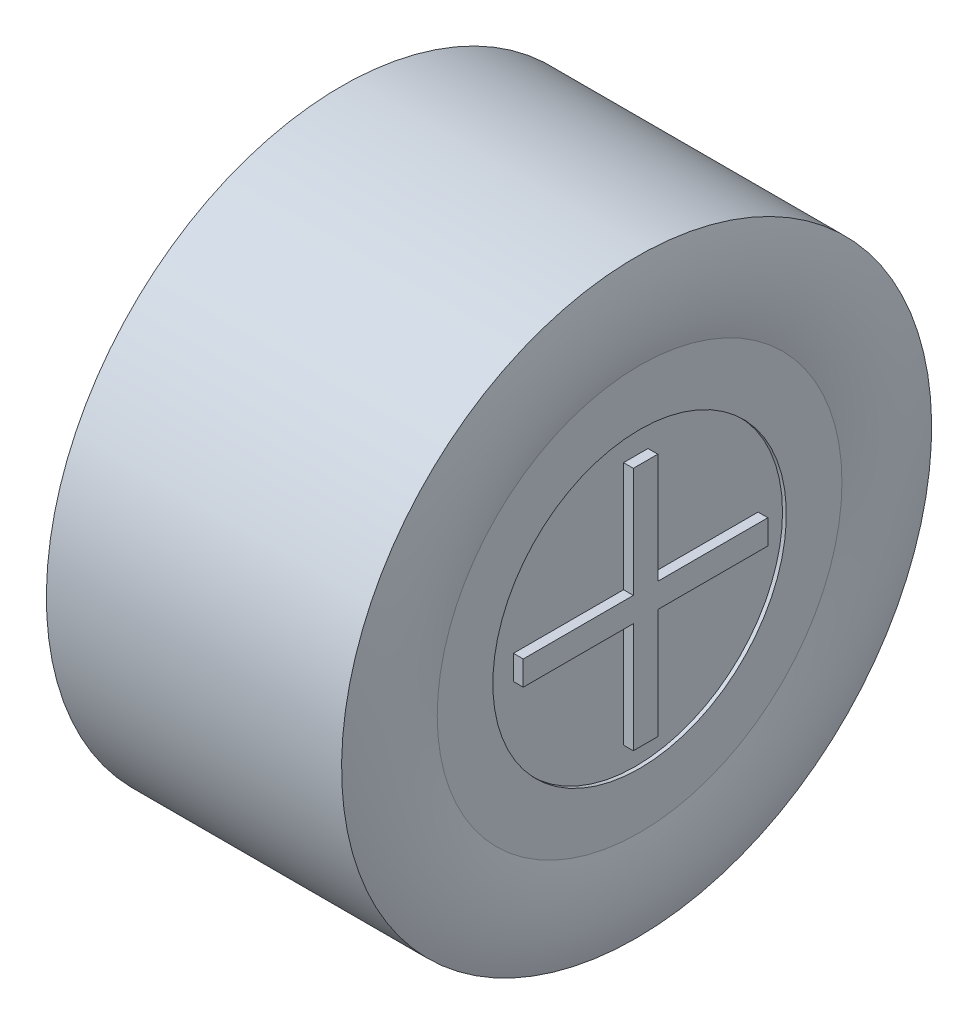
ISO-10303-21;
HEADER;
FILE_DESCRIPTION(('STEP AP214'),'2;1');
FILE_NAME('part.step','',(''),(''),'','','');
FILE_SCHEMA(('AUTOMOTIVE_DESIGN { 1 0 10303 214 1 1 1 1 }'));
ENDSEC;
DATA;
#1=APPLICATION_CONTEXT('core data for automotive mechanical design processes');
#2=APPLICATION_PROTOCOL_DEFINITION('international standard','automotive_design',2000,#1);
#3=PRODUCT_CONTEXT('',#1,'mechanical');
#4=PRODUCT('Part','Part','',(#3));
#5=PRODUCT_RELATED_PRODUCT_CATEGORY('part','',(#4));
#6=PRODUCT_DEFINITION_FORMATION('','',#4);
#7=PRODUCT_DEFINITION_CONTEXT('part definition',#1,'design');
#8=PRODUCT_DEFINITION('design','',#6,#7);
#9=PRODUCT_DEFINITION_SHAPE('','',#8);
#10=(LENGTH_UNIT() NAMED_UNIT(*) SI_UNIT(.MILLI.,.METRE.));
#11=(NAMED_UNIT(*) PLANE_ANGLE_UNIT() SI_UNIT($,.RADIAN.));
#12=(NAMED_UNIT(*) SI_UNIT($,.STERADIAN.) SOLID_ANGLE_UNIT());
#13=UNCERTAINTY_MEASURE_WITH_UNIT(LENGTH_MEASURE(1.E-05),#10,'distance_accuracy_value','');
#14=(GEOMETRIC_REPRESENTATION_CONTEXT(3) GLOBAL_UNCERTAINTY_ASSIGNED_CONTEXT((#13)) GLOBAL_UNIT_ASSIGNED_CONTEXT((#10,
#11,#12)) REPRESENTATION_CONTEXT('',''));
#15=CARTESIAN_POINT('',(0.,0.,0.));
#16=DIRECTION('',(0.,0.,1.));
#17=DIRECTION('',(1.,0.,0.));
#18=AXIS2_PLACEMENT_3D('',#15,#16,#17);
#19=CARTESIAN_POINT('',(30.,0.,0.));
#20=DIRECTION('',(1.,0.,0.));
#21=DIRECTION('',(0.,0.,-1.));
#22=AXIS2_PLACEMENT_3D('',#19,#20,#21);
#23=PLANE('',#22);
#24=CARTESIAN_POINT('',(30.,0.,0.));
#25=DIRECTION('',(1.,0.,0.));
#26=DIRECTION('',(0.,0.,-1.));
#27=AXIS2_PLACEMENT_3D('',#24,#25,#26);
#28=CIRCLE('',#27,30.);
#29=CARTESIAN_POINT('',(30.,0.,-30.));
#30=VERTEX_POINT('',#29);
#31=EDGE_CURVE('E165',#30,#30,#28,.T.);
#32=ORIENTED_EDGE('',*,*,#31,.T.);
#33=EDGE_LOOP('',(#32));
#34=FACE_BOUND('',#33,.T.);
#35=DIRECTION('',(0.,-1.,0.));
#36=VECTOR('',#35,1.);
#37=CARTESIAN_POINT('',(30.,0.,2.5));
#38=LINE('',#37,#36);
#39=CARTESIAN_POINT('',(30.,25.,2.5));
#40=VERTEX_POINT('',#39);
#41=CARTESIAN_POINT('',(30.,2.5,2.5));
#42=VERTEX_POINT('',#41);
#43=EDGE_CURVE('E60',#40,#42,#38,.T.);
#44=ORIENTED_EDGE('',*,*,#43,.F.);
#45=DIRECTION('',(0.,0.,1.));
#46=VECTOR('',#45,1.);
#47=CARTESIAN_POINT('',(30.,25.,0.));
#48=LINE('',#47,#46);
#49=CARTESIAN_POINT('',(30.,25.,-2.5));
#50=VERTEX_POINT('',#49);
#51=EDGE_CURVE('E158',#50,#40,#48,.T.);
#52=ORIENTED_EDGE('',*,*,#51,.F.);
#53=DIRECTION('',(0.,-1.,0.));
#54=VECTOR('',#53,1.);
#55=CARTESIAN_POINT('',(30.,0.,-2.5));
#56=LINE('',#55,#54);
#57=CARTESIAN_POINT('',(30.,2.5,-2.5));
#58=VERTEX_POINT('',#57);
#59=EDGE_CURVE('E155',#50,#58,#56,.T.);
#60=ORIENTED_EDGE('',*,*,#59,.T.);
#61=DIRECTION('',(0.,0.,-1.));
#62=VECTOR('',#61,1.);
#63=CARTESIAN_POINT('',(30.,2.5,0.));
#64=LINE('',#63,#62);
#65=CARTESIAN_POINT('',(30.,2.5,-25.));
#66=VERTEX_POINT('',#65);
#67=EDGE_CURVE('E562',#58,#66,#64,.T.);
#68=ORIENTED_EDGE('',*,*,#67,.T.);
#69=DIRECTION('',(0.,-1.,0.));
#70=VECTOR('',#69,1.);
#71=CARTESIAN_POINT('',(30.,0.,-25.));
#72=LINE('',#71,#70);
#73=CARTESIAN_POINT('',(30.,-2.5,-25.));
#74=VERTEX_POINT('',#73);
#75=EDGE_CURVE('E565',#66,#74,#72,.T.);
#76=ORIENTED_EDGE('',*,*,#75,.T.);
#77=DIRECTION('',(0.,0.,-1.));
#78=VECTOR('',#77,1.);
#79=CARTESIAN_POINT('',(30.,-2.5,0.));
#80=LINE('',#79,#78);
#81=CARTESIAN_POINT('',(30.,-2.5,-2.5));
#82=VERTEX_POINT('',#81);
#83=EDGE_CURVE('E629',#82,#74,#80,.T.);
#84=ORIENTED_EDGE('',*,*,#83,.F.);
#85=DIRECTION('',(0.,-1.,0.));
#86=VECTOR('',#85,1.);
#87=CARTESIAN_POINT('',(30.,0.,-2.5));
#88=LINE('',#87,#86);
#89=CARTESIAN_POINT('',(30.,-25.,-2.5));
#90=VERTEX_POINT('',#89);
#91=EDGE_CURVE('E626',#82,#90,#88,.T.);
#92=ORIENTED_EDGE('',*,*,#91,.T.);
#93=DIRECTION('',(0.,0.,1.));
#94=VECTOR('',#93,1.);
#95=CARTESIAN_POINT('',(30.,-25.,0.));
#96=LINE('',#95,#94);
#97=CARTESIAN_POINT('',(30.,-25.,2.5));
#98=VERTEX_POINT('',#97);
#99=EDGE_CURVE('E623',#90,#98,#96,.T.);
#100=ORIENTED_EDGE('',*,*,#99,.T.);
#101=DIRECTION('',(0.,-1.,0.));
#102=VECTOR('',#101,1.);
#103=CARTESIAN_POINT('',(30.,0.,2.5));
#104=LINE('',#103,#102);
#105=CARTESIAN_POINT('',(30.,-2.5,2.5));
#106=VERTEX_POINT('',#105);
#107=EDGE_CURVE('E619',#106,#98,#104,.T.);
#108=ORIENTED_EDGE('',*,*,#107,.F.);
#109=DIRECTION('',(0.,0.,-1.));
#110=VECTOR('',#109,1.);
#111=CARTESIAN_POINT('',(30.,-2.5,0.));
#112=LINE('',#111,#110);
#113=CARTESIAN_POINT('',(30.,-2.5,25.));
#114=VERTEX_POINT('',#113);
#115=EDGE_CURVE('E611',#114,#106,#112,.T.);
#116=ORIENTED_EDGE('',*,*,#115,.F.);
#117=DIRECTION('',(0.,-1.,0.));
#118=VECTOR('',#117,1.);
#119=CARTESIAN_POINT('',(30.,0.,25.));
#120=LINE('',#119,#118);
#121=CARTESIAN_POINT('',(30.,2.5,25.));
#122=VERTEX_POINT('',#121);
#123=EDGE_CURVE('E605',#122,#114,#120,.T.);
#124=ORIENTED_EDGE('',*,*,#123,.F.);
#125=DIRECTION('',(0.,0.,-1.));
#126=VECTOR('',#125,1.);
#127=CARTESIAN_POINT('',(30.,2.5,0.));
#128=LINE('',#127,#126);
#129=EDGE_CURVE('E65',#122,#42,#128,.T.);
#130=ORIENTED_EDGE('',*,*,#129,.T.);
#131=EDGE_LOOP('',(#44,#52,#60,#68,#76,#84,#92,#100,#108,#116,#124,#130));
#132=FACE_BOUND('',#131,.T.);
#133=ADVANCED_FACE('F42',(#34,#132),#23,.T.);
#134=CARTESIAN_POINT('',(-80.6535607493196,0.,0.));
#135=DIRECTION('',(-1.,0.,0.));
#136=DIRECTION('',(0.,-1.,0.));
#137=AXIS2_PLACEMENT_3D('',#134,#135,#136);
#138=CYLINDRICAL_SURFACE('',#137,30.);
#139=CARTESIAN_POINT('',(-30.7818119286805,0.,0.));
#140=DIRECTION('',(-1.,0.,0.));
#141=DIRECTION('',(0.,-1.,0.));
#142=AXIS2_PLACEMENT_3D('',#139,#140,#141);
#143=CIRCLE('',#142,30.);
#144=CARTESIAN_POINT('',(-30.7818119286805,-30.,0.));
#145=VERTEX_POINT('',#144);
#146=EDGE_CURVE('E274',#145,#145,#143,.T.);
#147=ORIENTED_EDGE('',*,*,#146,.T.);
#148=EDGE_LOOP('',(#147));
#149=FACE_BOUND('',#148,.T.);
#150=CARTESIAN_POINT('',(-30.,0.,0.));
#151=DIRECTION('',(1.,0.,0.));
#152=DIRECTION('',(0.,0.,-1.));
#153=AXIS2_PLACEMENT_3D('',#150,#151,#152);
#154=CIRCLE('',#153,30.);
#155=CARTESIAN_POINT('',(-30.,0.,-30.));
#156=VERTEX_POINT('',#155);
#157=EDGE_CURVE('E53',#156,#156,#154,.F.);
#158=ORIENTED_EDGE('',*,*,#157,.F.);
#159=EDGE_LOOP('',(#158));
#160=FACE_BOUND('',#159,.T.);
#161=ADVANCED_FACE('F286',(#149,#160),#138,.F.);
#162=CARTESIAN_POINT('',(-30.7818119286805,30.,0.));
#163=DIRECTION('',(1.,0.,0.));
#164=DIRECTION('',(0.,1.,0.));
#165=AXIS2_PLACEMENT_3D('',#162,#163,#164);
#166=PLANE('',#165);
#167=ORIENTED_EDGE('',*,*,#146,.F.);
#168=EDGE_LOOP('',(#167));
#169=FACE_BOUND('',#168,.T.);
#170=CARTESIAN_POINT('',(-30.7818119286805,0.,0.));
#171=DIRECTION('',(-1.,0.,0.));
#172=DIRECTION('',(0.,-1.,0.));
#173=AXIS2_PLACEMENT_3D('',#170,#171,#172);
#174=CIRCLE('',#173,41.3646241331419);
#175=CARTESIAN_POINT('',(-30.7818119286805,-41.3646241331418,0.));
#176=VERTEX_POINT('',#175);
#177=EDGE_CURVE('E270',#176,#176,#174,.T.);
#178=ORIENTED_EDGE('',*,*,#177,.T.);
#179=EDGE_LOOP('',(#178));
#180=FACE_BOUND('',#179,.T.);
#181=ADVANCED_FACE('F229',(#169,#180),#166,.F.);
#182=CARTESIAN_POINT('',(-30.1715902193962,60.3044283000212,0.));
#183=CARTESIAN_POINT('',(-33.1631614911437,50.9503913846076,0.));
#184=CARTESIAN_POINT('',(-30.7818119286805,41.3646241331419,0.));
#185=B_SPLINE_CURVE_WITH_KNOTS('',2,(#182,#183,#184),.UNSPECIFIED.,.F.,.F.,(3,3),(0.,1.),.UNSPECIFIED.);
#186=CARTESIAN_POINT('',(-80.6535607493196,0.,0.));
#187=DIRECTION('',(-1.,0.,0.));
#188=AXIS1_PLACEMENT('',#186,#187);
#189=SURFACE_OF_REVOLUTION('',#185,#188);
#190=ORIENTED_EDGE('',*,*,#177,.F.);
#191=EDGE_LOOP('',(#190));
#192=FACE_BOUND('',#191,.T.);
#193=CARTESIAN_POINT('',(-30.1715902193962,0.,0.));
#194=DIRECTION('',(-1.,0.,0.));
#195=DIRECTION('',(0.,-1.,0.));
#196=AXIS2_PLACEMENT_3D('',#193,#194,#195);
#197=CIRCLE('',#196,60.3044283000212);
#198=CARTESIAN_POINT('',(-30.1715902193962,-60.3044283000212,0.));
#199=VERTEX_POINT('',#198);
#200=EDGE_CURVE('E266',#199,#199,#197,.T.);
#201=ORIENTED_EDGE('',*,*,#200,.T.);
#202=EDGE_LOOP('',(#201));
#203=FACE_BOUND('',#202,.T.);
#204=ADVANCED_FACE('F225',(#192,#203),#189,.T.);
#205=CARTESIAN_POINT('',(-80.6535607493196,0.,0.));
#206=DIRECTION('',(-1.,0.,0.));
#207=DIRECTION('',(0.,-1.,0.));
#208=AXIS2_PLACEMENT_3D('',#205,#206,#207);
#209=CYLINDRICAL_SURFACE('',#208,60.3044283000212);
#210=ORIENTED_EDGE('',*,*,#200,.F.);
#211=EDGE_LOOP('',(#210));
#212=FACE_BOUND('',#211,.T.);
#213=CARTESIAN_POINT('',(30.1715902193963,0.,0.));
#214=DIRECTION('',(-1.,0.,0.));
#215=DIRECTION('',(0.,-1.,0.));
#216=AXIS2_PLACEMENT_3D('',#213,#214,#215);
#217=CIRCLE('',#216,60.3044283000212);
#218=CARTESIAN_POINT('',(30.1715902193963,-60.3044283000212,0.));
#219=VERTEX_POINT('',#218);
#220=EDGE_CURVE('E262',#219,#219,#217,.T.);
#221=ORIENTED_EDGE('',*,*,#220,.T.);
#222=EDGE_LOOP('',(#221));
#223=FACE_BOUND('',#222,.T.);
#224=ADVANCED_FACE('F221',(#212,#223),#209,.T.);
#225=CARTESIAN_POINT('',(30.7818119286805,41.3646241331419,0.));
#226=CARTESIAN_POINT('',(33.1631614911437,50.9503913846076,0.));
#227=CARTESIAN_POINT('',(30.1715902193962,60.3044283000212,0.));
#228=B_SPLINE_CURVE_WITH_KNOTS('',2,(#225,#226,#227),.UNSPECIFIED.,.F.,.F.,(3,3),(0.,1.),.UNSPECIFIED.);
#229=CARTESIAN_POINT('',(-80.6535607493196,0.,0.));
#230=DIRECTION('',(-1.,0.,0.));
#231=AXIS1_PLACEMENT('',#229,#230);
#232=SURFACE_OF_REVOLUTION('',#228,#231);
#233=ORIENTED_EDGE('',*,*,#220,.F.);
#234=EDGE_LOOP('',(#233));
#235=FACE_BOUND('',#234,.T.);
#236=CARTESIAN_POINT('',(30.7818119286806,0.,0.));
#237=DIRECTION('',(-1.,0.,0.));
#238=DIRECTION('',(0.,-1.,0.));
#239=AXIS2_PLACEMENT_3D('',#236,#237,#238);
#240=CIRCLE('',#239,41.3646241331418);
#241=CARTESIAN_POINT('',(30.7818119286806,-41.3646241331418,0.));
#242=VERTEX_POINT('',#241);
#243=EDGE_CURVE('E258',#242,#242,#240,.T.);
#244=ORIENTED_EDGE('',*,*,#243,.T.);
#245=EDGE_LOOP('',(#244));
#246=FACE_BOUND('',#245,.T.);
#247=ADVANCED_FACE('F217',(#235,#246),#232,.T.);
#248=CARTESIAN_POINT('',(30.7818119286805,30.,0.));
#249=DIRECTION('',(-1.,0.,0.));
#250=DIRECTION('',(0.,-1.,0.));
#251=AXIS2_PLACEMENT_3D('',#248,#249,#250);
#252=PLANE('',#251);
#253=ORIENTED_EDGE('',*,*,#243,.F.);
#254=EDGE_LOOP('',(#253));
#255=FACE_BOUND('',#254,.T.);
#256=CARTESIAN_POINT('',(30.7818119286806,0.,0.));
#257=DIRECTION('',(-1.,0.,0.));
#258=DIRECTION('',(0.,-1.,0.));
#259=AXIS2_PLACEMENT_3D('',#256,#257,#258);
#260=CIRCLE('',#259,30.);
#261=CARTESIAN_POINT('',(30.7818119286806,-30.,0.));
#262=VERTEX_POINT('',#261);
#263=EDGE_CURVE('E254',#262,#262,#260,.T.);
#264=ORIENTED_EDGE('',*,*,#263,.T.);
#265=EDGE_LOOP('',(#264));
#266=FACE_BOUND('',#265,.T.);
#267=ADVANCED_FACE('F213',(#255,#266),#252,.F.);
#268=CARTESIAN_POINT('',(-80.6535607493196,0.,0.));
#269=DIRECTION('',(-1.,0.,0.));
#270=DIRECTION('',(0.,-1.,0.));
#271=AXIS2_PLACEMENT_3D('',#268,#269,#270);
#272=CYLINDRICAL_SURFACE('',#271,30.);
#273=ORIENTED_EDGE('',*,*,#31,.F.);
#274=EDGE_LOOP('',(#273));
#275=FACE_BOUND('',#274,.T.);
#276=ORIENTED_EDGE('',*,*,#263,.F.);
#277=EDGE_LOOP('',(#276));
#278=FACE_BOUND('',#277,.T.);
#279=ADVANCED_FACE('F209',(#275,#278),#272,.F.);
#280=CARTESIAN_POINT('',(-30.,0.,0.));
#281=DIRECTION('',(1.,0.,0.));
#282=DIRECTION('',(0.,0.,-1.));
#283=AXIS2_PLACEMENT_3D('',#280,#281,#282);
#284=PLANE('',#283);
#285=CARTESIAN_POINT('',(-30.,0.,0.));
#286=DIRECTION('',(1.,0.,0.));
#287=DIRECTION('',(0.,0.,-1.));
#288=AXIS2_PLACEMENT_3D('',#285,#286,#287);
#289=CIRCLE('',#288,7.5);
#290=CARTESIAN_POINT('',(-30.,0.,-7.5));
#291=VERTEX_POINT('',#290);
#292=EDGE_CURVE('E11',#291,#291,#289,.F.);
#293=ORIENTED_EDGE('',*,*,#292,.F.);
#294=EDGE_LOOP('',(#293));
#295=FACE_BOUND('',#294,.T.);
#296=ORIENTED_EDGE('',*,*,#157,.T.);
#297=EDGE_LOOP('',(#296));
#298=FACE_BOUND('',#297,.T.);
#299=ADVANCED_FACE('F212',(#295,#298),#284,.F.);
#300=CARTESIAN_POINT('',(-67.14,0.,0.));
#301=DIRECTION('',(1.,0.,0.));
#302=DIRECTION('',(0.,0.,-1.));
#303=AXIS2_PLACEMENT_3D('',#300,#301,#302);
#304=CYLINDRICAL_SURFACE('',#303,7.5);
#305=CARTESIAN_POINT('',(-67.14,0.,0.));
#306=DIRECTION('',(-1.,0.,0.));
#307=DIRECTION('',(0.,0.,1.));
#308=AXIS2_PLACEMENT_3D('',#305,#306,#307);
#309=CIRCLE('',#308,7.5);
#310=CARTESIAN_POINT('',(-67.14,0.,7.5));
#311=VERTEX_POINT('',#310);
#312=EDGE_CURVE('E160',#311,#311,#309,.T.);
#313=ORIENTED_EDGE('',*,*,#312,.F.);
#314=EDGE_LOOP('',(#313));
#315=FACE_BOUND('',#314,.T.);
#316=ORIENTED_EDGE('',*,*,#292,.T.);
#317=EDGE_LOOP('',(#316));
#318=FACE_BOUND('',#317,.T.);
#319=ADVANCED_FACE('F317',(#315,#318),#304,.T.);
#320=CARTESIAN_POINT('',(-67.14,0.,0.));
#321=DIRECTION('',(-1.,0.,0.));
#322=DIRECTION('',(0.,0.,1.));
#323=AXIS2_PLACEMENT_3D('',#320,#321,#322);
#324=PLANE('',#323);
#325=ORIENTED_EDGE('',*,*,#312,.T.);
#326=EDGE_LOOP('',(#325));
#327=FACE_BOUND('',#326,.T.);
#328=ADVANCED_FACE('F322',(#327),#324,.T.);
#329=CARTESIAN_POINT('',(32.,25.,0.));
#330=DIRECTION('',(0.,-1.,0.));
#331=DIRECTION('',(0.,0.,-1.));
#332=AXIS2_PLACEMENT_3D('',#329,#330,#331);
#333=PLANE('',#332);
#334=ORIENTED_EDGE('',*,*,#51,.T.);
#335=DIRECTION('',(-1.,0.,0.));
#336=VECTOR('',#335,1.);
#337=CARTESIAN_POINT('',(32.,25.,2.5));
#338=LINE('',#337,#336);
#339=CARTESIAN_POINT('',(32.,25.,2.5));
#340=VERTEX_POINT('',#339);
#341=EDGE_CURVE('E136',#340,#40,#338,.T.);
#342=ORIENTED_EDGE('',*,*,#341,.F.);
#343=DIRECTION('',(0.,0.,1.));
#344=VECTOR('',#343,1.);
#345=CARTESIAN_POINT('',(32.,25.,0.));
#346=LINE('',#345,#344);
#347=CARTESIAN_POINT('',(32.,25.,-2.5));
#348=VERTEX_POINT('',#347);
#349=EDGE_CURVE('E144',#348,#340,#346,.T.);
#350=ORIENTED_EDGE('',*,*,#349,.F.);
#351=DIRECTION('',(-1.,0.,0.));
#352=VECTOR('',#351,1.);
#353=CARTESIAN_POINT('',(32.,25.,-2.5));
#354=LINE('',#353,#352);
#355=EDGE_CURVE('E558',#348,#50,#354,.T.);
#356=ORIENTED_EDGE('',*,*,#355,.T.);
#357=EDGE_LOOP('',(#334,#342,#350,#356));
#358=FACE_BOUND('',#357,.T.);
#359=ADVANCED_FACE('F157',(#358),#333,.F.);
#360=CARTESIAN_POINT('',(32.,0.,2.5));
#361=DIRECTION('',(0.,0.,-1.));
#362=DIRECTION('',(0.,1.,0.));
#363=AXIS2_PLACEMENT_3D('',#360,#361,#362);
#364=PLANE('',#363);
#365=ORIENTED_EDGE('',*,*,#43,.T.);
#366=DIRECTION('',(-1.,0.,0.));
#367=VECTOR('',#366,1.);
#368=CARTESIAN_POINT('',(32.,2.5,2.5));
#369=LINE('',#368,#367);
#370=CARTESIAN_POINT('',(32.,2.5,2.5));
#371=VERTEX_POINT('',#370);
#372=EDGE_CURVE('E138',#371,#42,#369,.T.);
#373=ORIENTED_EDGE('',*,*,#372,.F.);
#374=DIRECTION('',(0.,-1.,0.));
#375=VECTOR('',#374,1.);
#376=CARTESIAN_POINT('',(32.,0.,2.5));
#377=LINE('',#376,#375);
#378=EDGE_CURVE('E132',#340,#371,#377,.T.);
#379=ORIENTED_EDGE('',*,*,#378,.F.);
#380=ORIENTED_EDGE('',*,*,#341,.T.);
#381=EDGE_LOOP('',(#365,#373,#379,#380));
#382=FACE_BOUND('',#381,.T.);
#383=ADVANCED_FACE('F134',(#382),#364,.F.);
#384=CARTESIAN_POINT('',(32.,2.5,0.));
#385=DIRECTION('',(0.,1.,0.));
#386=DIRECTION('',(0.,0.,1.));
#387=AXIS2_PLACEMENT_3D('',#384,#385,#386);
#388=PLANE('',#387);
#389=ORIENTED_EDGE('',*,*,#129,.F.);
#390=DIRECTION('',(-1.,0.,0.));
#391=VECTOR('',#390,1.);
#392=CARTESIAN_POINT('',(32.,2.5,25.));
#393=LINE('',#392,#391);
#394=CARTESIAN_POINT('',(32.,2.5,25.));
#395=VERTEX_POINT('',#394);
#396=EDGE_CURVE('E167',#395,#122,#393,.T.);
#397=ORIENTED_EDGE('',*,*,#396,.F.);
#398=DIRECTION('',(0.,0.,-1.));
#399=VECTOR('',#398,1.);
#400=CARTESIAN_POINT('',(32.,2.5,0.));
#401=LINE('',#400,#399);
#402=EDGE_CURVE('E143',#395,#371,#401,.T.);
#403=ORIENTED_EDGE('',*,*,#402,.T.);
#404=ORIENTED_EDGE('',*,*,#372,.T.);
#405=EDGE_LOOP('',(#389,#397,#403,#404));
#406=FACE_BOUND('',#405,.T.);
#407=ADVANCED_FACE('F331',(#406),#388,.T.);
#408=CARTESIAN_POINT('',(32.,0.,25.));
#409=DIRECTION('',(0.,0.,-1.));
#410=DIRECTION('',(-1.,0.,0.));
#411=AXIS2_PLACEMENT_3D('',#408,#409,#410);
#412=PLANE('',#411);
#413=ORIENTED_EDGE('',*,*,#123,.T.);
#414=DIRECTION('',(-1.,0.,0.));
#415=VECTOR('',#414,1.);
#416=CARTESIAN_POINT('',(32.,-2.5,25.));
#417=LINE('',#416,#415);
#418=CARTESIAN_POINT('',(32.,-2.5,25.));
#419=VERTEX_POINT('',#418);
#420=EDGE_CURVE('E597',#419,#114,#417,.T.);
#421=ORIENTED_EDGE('',*,*,#420,.F.);
#422=DIRECTION('',(0.,-1.,0.));
#423=VECTOR('',#422,1.);
#424=CARTESIAN_POINT('',(32.,0.,25.));
#425=LINE('',#424,#423);
#426=EDGE_CURVE('E606',#395,#419,#425,.T.);
#427=ORIENTED_EDGE('',*,*,#426,.F.);
#428=ORIENTED_EDGE('',*,*,#396,.T.);
#429=EDGE_LOOP('',(#413,#421,#427,#428));
#430=FACE_BOUND('',#429,.T.);
#431=ADVANCED_FACE('F334',(#430),#412,.F.);
#432=CARTESIAN_POINT('',(32.,-2.5,0.));
#433=DIRECTION('',(0.,1.,0.));
#434=DIRECTION('',(0.,0.,1.));
#435=AXIS2_PLACEMENT_3D('',#432,#433,#434);
#436=PLANE('',#435);
#437=ORIENTED_EDGE('',*,*,#115,.T.);
#438=DIRECTION('',(-1.,0.,0.));
#439=VECTOR('',#438,1.);
#440=CARTESIAN_POINT('',(32.,-2.5,2.5));
#441=LINE('',#440,#439);
#442=CARTESIAN_POINT('',(32.,-2.5,2.5));
#443=VERTEX_POINT('',#442);
#444=EDGE_CURVE('E593',#443,#106,#441,.T.);
#445=ORIENTED_EDGE('',*,*,#444,.F.);
#446=DIRECTION('',(0.,0.,-1.));
#447=VECTOR('',#446,1.);
#448=CARTESIAN_POINT('',(32.,-2.5,0.));
#449=LINE('',#448,#447);
#450=EDGE_CURVE('E652',#419,#443,#449,.T.);
#451=ORIENTED_EDGE('',*,*,#450,.F.);
#452=ORIENTED_EDGE('',*,*,#420,.T.);
#453=EDGE_LOOP('',(#437,#445,#451,#452));
#454=FACE_BOUND('',#453,.T.);
#455=ADVANCED_FACE('F338',(#454),#436,.F.);
#456=CARTESIAN_POINT('',(32.,0.,2.5));
#457=DIRECTION('',(0.,0.,-1.));
#458=DIRECTION('',(0.,1.,0.));
#459=AXIS2_PLACEMENT_3D('',#456,#457,#458);
#460=PLANE('',#459);
#461=ORIENTED_EDGE('',*,*,#107,.T.);
#462=DIRECTION('',(-1.,0.,0.));
#463=VECTOR('',#462,1.);
#464=CARTESIAN_POINT('',(32.,-25.,2.5));
#465=LINE('',#464,#463);
#466=CARTESIAN_POINT('',(32.,-25.,2.5));
#467=VERTEX_POINT('',#466);
#468=EDGE_CURVE('E589',#467,#98,#465,.T.);
#469=ORIENTED_EDGE('',*,*,#468,.F.);
#470=DIRECTION('',(0.,-1.,0.));
#471=VECTOR('',#470,1.);
#472=CARTESIAN_POINT('',(32.,0.,2.5));
#473=LINE('',#472,#471);
#474=EDGE_CURVE('E650',#443,#467,#473,.T.);
#475=ORIENTED_EDGE('',*,*,#474,.F.);
#476=ORIENTED_EDGE('',*,*,#444,.T.);
#477=EDGE_LOOP('',(#461,#469,#475,#476));
#478=FACE_BOUND('',#477,.T.);
#479=ADVANCED_FACE('F342',(#478),#460,.F.);
#480=CARTESIAN_POINT('',(32.,-25.,0.));
#481=DIRECTION('',(0.,-1.,0.));
#482=DIRECTION('',(0.,0.,-1.));
#483=AXIS2_PLACEMENT_3D('',#480,#481,#482);
#484=PLANE('',#483);
#485=ORIENTED_EDGE('',*,*,#99,.F.);
#486=DIRECTION('',(-1.,0.,0.));
#487=VECTOR('',#486,1.);
#488=CARTESIAN_POINT('',(32.,-25.,-2.5));
#489=LINE('',#488,#487);
#490=CARTESIAN_POINT('',(32.,-25.,-2.5));
#491=VERTEX_POINT('',#490);
#492=EDGE_CURVE('E585',#491,#90,#489,.T.);
#493=ORIENTED_EDGE('',*,*,#492,.F.);
#494=DIRECTION('',(0.,0.,1.));
#495=VECTOR('',#494,1.);
#496=CARTESIAN_POINT('',(32.,-25.,0.));
#497=LINE('',#496,#495);
#498=EDGE_CURVE('E647',#491,#467,#497,.T.);
#499=ORIENTED_EDGE('',*,*,#498,.T.);
#500=ORIENTED_EDGE('',*,*,#468,.T.);
#501=EDGE_LOOP('',(#485,#493,#499,#500));
#502=FACE_BOUND('',#501,.T.);
#503=ADVANCED_FACE('F346',(#502),#484,.T.);
#504=CARTESIAN_POINT('',(32.,0.,-2.5));
#505=DIRECTION('',(0.,0.,-1.));
#506=DIRECTION('',(0.,1.,0.));
#507=AXIS2_PLACEMENT_3D('',#504,#505,#506);
#508=PLANE('',#507);
#509=ORIENTED_EDGE('',*,*,#91,.F.);
#510=DIRECTION('',(-1.,0.,0.));
#511=VECTOR('',#510,1.);
#512=CARTESIAN_POINT('',(32.,-2.5,-2.5));
#513=LINE('',#512,#511);
#514=CARTESIAN_POINT('',(32.,-2.5,-2.5));
#515=VERTEX_POINT('',#514);
#516=EDGE_CURVE('E581',#515,#82,#513,.T.);
#517=ORIENTED_EDGE('',*,*,#516,.F.);
#518=DIRECTION('',(0.,-1.,0.));
#519=VECTOR('',#518,1.);
#520=CARTESIAN_POINT('',(32.,0.,-2.5));
#521=LINE('',#520,#519);
#522=EDGE_CURVE('E663',#515,#491,#521,.T.);
#523=ORIENTED_EDGE('',*,*,#522,.T.);
#524=ORIENTED_EDGE('',*,*,#492,.T.);
#525=EDGE_LOOP('',(#509,#517,#523,#524));
#526=FACE_BOUND('',#525,.T.);
#527=ADVANCED_FACE('F350',(#526),#508,.T.);
#528=CARTESIAN_POINT('',(32.,-2.5,0.));
#529=DIRECTION('',(0.,1.,0.));
#530=DIRECTION('',(0.,0.,1.));
#531=AXIS2_PLACEMENT_3D('',#528,#529,#530);
#532=PLANE('',#531);
#533=ORIENTED_EDGE('',*,*,#83,.T.);
#534=DIRECTION('',(-1.,0.,0.));
#535=VECTOR('',#534,1.);
#536=CARTESIAN_POINT('',(32.,-2.5,-25.));
#537=LINE('',#536,#535);
#538=CARTESIAN_POINT('',(32.,-2.5,-25.));
#539=VERTEX_POINT('',#538);
#540=EDGE_CURVE('E577',#539,#74,#537,.T.);
#541=ORIENTED_EDGE('',*,*,#540,.F.);
#542=DIRECTION('',(0.,0.,-1.));
#543=VECTOR('',#542,1.);
#544=CARTESIAN_POINT('',(32.,-2.5,0.));
#545=LINE('',#544,#543);
#546=EDGE_CURVE('E640',#515,#539,#545,.T.);
#547=ORIENTED_EDGE('',*,*,#546,.F.);
#548=ORIENTED_EDGE('',*,*,#516,.T.);
#549=EDGE_LOOP('',(#533,#541,#547,#548));
#550=FACE_BOUND('',#549,.T.);
#551=ADVANCED_FACE('F354',(#550),#532,.F.);
#552=CARTESIAN_POINT('',(32.,0.,-25.));
#553=DIRECTION('',(0.,0.,-1.));
#554=DIRECTION('',(-1.,0.,0.));
#555=AXIS2_PLACEMENT_3D('',#552,#553,#554);
#556=PLANE('',#555);
#557=ORIENTED_EDGE('',*,*,#75,.F.);
#558=DIRECTION('',(-1.,0.,0.));
#559=VECTOR('',#558,1.);
#560=CARTESIAN_POINT('',(32.,2.5,-25.));
#561=LINE('',#560,#559);
#562=CARTESIAN_POINT('',(32.,2.5,-25.));
#563=VERTEX_POINT('',#562);
#564=EDGE_CURVE('E573',#563,#66,#561,.T.);
#565=ORIENTED_EDGE('',*,*,#564,.F.);
#566=DIRECTION('',(0.,-1.,0.));
#567=VECTOR('',#566,1.);
#568=CARTESIAN_POINT('',(32.,0.,-25.));
#569=LINE('',#568,#567);
#570=EDGE_CURVE('E637',#563,#539,#569,.T.);
#571=ORIENTED_EDGE('',*,*,#570,.T.);
#572=ORIENTED_EDGE('',*,*,#540,.T.);
#573=EDGE_LOOP('',(#557,#565,#571,#572));
#574=FACE_BOUND('',#573,.T.);
#575=ADVANCED_FACE('F358',(#574),#556,.T.);
#576=CARTESIAN_POINT('',(32.,2.5,0.));
#577=DIRECTION('',(0.,1.,0.));
#578=DIRECTION('',(0.,0.,1.));
#579=AXIS2_PLACEMENT_3D('',#576,#577,#578);
#580=PLANE('',#579);
#581=ORIENTED_EDGE('',*,*,#67,.F.);
#582=DIRECTION('',(-1.,0.,0.));
#583=VECTOR('',#582,1.);
#584=CARTESIAN_POINT('',(32.,2.5,-2.5));
#585=LINE('',#584,#583);
#586=CARTESIAN_POINT('',(32.,2.5,-2.5));
#587=VERTEX_POINT('',#586);
#588=EDGE_CURVE('E559',#587,#58,#585,.T.);
#589=ORIENTED_EDGE('',*,*,#588,.F.);
#590=DIRECTION('',(0.,0.,-1.));
#591=VECTOR('',#590,1.);
#592=CARTESIAN_POINT('',(32.,2.5,0.));
#593=LINE('',#592,#591);
#594=EDGE_CURVE('E670',#587,#563,#593,.T.);
#595=ORIENTED_EDGE('',*,*,#594,.T.);
#596=ORIENTED_EDGE('',*,*,#564,.T.);
#597=EDGE_LOOP('',(#581,#589,#595,#596));
#598=FACE_BOUND('',#597,.T.);
#599=ADVANCED_FACE('F362',(#598),#580,.T.);
#600=CARTESIAN_POINT('',(32.,0.,-2.5));
#601=DIRECTION('',(0.,0.,-1.));
#602=DIRECTION('',(0.,1.,0.));
#603=AXIS2_PLACEMENT_3D('',#600,#601,#602);
#604=PLANE('',#603);
#605=ORIENTED_EDGE('',*,*,#59,.F.);
#606=ORIENTED_EDGE('',*,*,#355,.F.);
#607=DIRECTION('',(0.,-1.,0.));
#608=VECTOR('',#607,1.);
#609=CARTESIAN_POINT('',(32.,0.,-2.5));
#610=LINE('',#609,#608);
#611=EDGE_CURVE('E151',#348,#587,#610,.T.);
#612=ORIENTED_EDGE('',*,*,#611,.T.);
#613=ORIENTED_EDGE('',*,*,#588,.T.);
#614=EDGE_LOOP('',(#605,#606,#612,#613));
#615=FACE_BOUND('',#614,.T.);
#616=ADVANCED_FACE('F366',(#615),#604,.T.);
#617=CARTESIAN_POINT('',(32.,0.,0.));
#618=DIRECTION('',(1.,0.,0.));
#619=DIRECTION('',(0.,0.,-1.));
#620=AXIS2_PLACEMENT_3D('',#617,#618,#619);
#621=PLANE('',#620);
#622=ORIENTED_EDGE('',*,*,#349,.T.);
#623=ORIENTED_EDGE('',*,*,#378,.T.);
#624=ORIENTED_EDGE('',*,*,#402,.F.);
#625=ORIENTED_EDGE('',*,*,#426,.T.);
#626=ORIENTED_EDGE('',*,*,#450,.T.);
#627=ORIENTED_EDGE('',*,*,#474,.T.);
#628=ORIENTED_EDGE('',*,*,#498,.F.);
#629=ORIENTED_EDGE('',*,*,#522,.F.);
#630=ORIENTED_EDGE('',*,*,#546,.T.);
#631=ORIENTED_EDGE('',*,*,#570,.F.);
#632=ORIENTED_EDGE('',*,*,#594,.F.);
#633=ORIENTED_EDGE('',*,*,#611,.F.);
#634=EDGE_LOOP('',(#622,#623,#624,#625,#626,#627,#628,#629,#630,#631,#632,#633));
#635=FACE_BOUND('',#634,.T.);
#636=ADVANCED_FACE('F148',(#635),#621,.T.);
#637=CLOSED_SHELL('',(#133,#161,#181,#204,#224,#247,#267,#279,#299,#319,#328,#359,#383,#407,
#431,#455,#479,#503,#527,#551,#575,#599,#616,#636));
#638=CARTESIAN_POINT('',(30.,0.,0.));
#639=DIRECTION('',(-1.,0.,0.));
#640=DIRECTION('',(0.,0.,1.));
#641=AXIS2_PLACEMENT_3D('',#638,#639,#640);
#642=CYLINDRICAL_SURFACE('',#641,30.);
#643=CARTESIAN_POINT('',(27.8781745096087,0.,0.));
#644=DIRECTION('',(-1.,0.,0.));
#645=DIRECTION('',(0.,-1.,0.));
#646=AXIS2_PLACEMENT_3D('',#643,#644,#645);
#647=CIRCLE('',#646,30.);
#648=CARTESIAN_POINT('',(27.8781745096087,-30.,0.));
#649=VERTEX_POINT('',#648);
#650=EDGE_CURVE('E250',#649,#649,#647,.T.);
#651=ORIENTED_EDGE('',*,*,#650,.T.);
#652=EDGE_LOOP('',(#651));
#653=FACE_BOUND('',#652,.T.);
#654=CARTESIAN_POINT('',(-27.8781745096087,0.,0.));
#655=DIRECTION('',(-1.,0.,0.));
#656=DIRECTION('',(0.,-1.,0.));
#657=AXIS2_PLACEMENT_3D('',#654,#655,#656);
#658=CIRCLE('',#657,30.);
#659=CARTESIAN_POINT('',(-27.8781745096087,-30.,0.));
#660=VERTEX_POINT('',#659);
#661=EDGE_CURVE('E174',#660,#660,#658,.F.);
#662=ORIENTED_EDGE('',*,*,#661,.T.);
#663=EDGE_LOOP('',(#662));
#664=FACE_BOUND('',#663,.T.);
#665=ADVANCED_FACE('F305',(#653,#664),#642,.T.);
#666=CARTESIAN_POINT('',(-27.8781745096088,41.71989367416,0.));
#667=CARTESIAN_POINT('',(-27.9216185916233,41.894749248418,0.));
#668=CARTESIAN_POINT('',(-28.0113783795099,42.252720207937,0.));
#669=CARTESIAN_POINT('',(-28.1641033742223,42.9035312925109,0.));
#670=CARTESIAN_POINT('',(-28.4109860280384,44.0692473563329,0.));
#671=CARTESIAN_POINT('',(-28.7885206910167,46.3678811359494,0.));
#672=CARTESIAN_POINT('',(-29.015805627572,49.637320271337,0.));
#673=CARTESIAN_POINT('',(-28.793463146413,53.513952659258,0.));
#674=CARTESIAN_POINT('',(-28.304701892059,56.124903441554,0.));
#675=CARTESIAN_POINT('',(-27.9834456399673,57.400896506501,0.));
#676=B_SPLINE_CURVE_WITH_KNOTS('',3,(#666,#667,#668,#669,#670,#671,#672,#673,#674,#675),
.UNSPECIFIED.,.F.,.F.,(4,1,1,1,1,1,1,4),(0.117139278288512,0.145290689787366,0.173442101286221,
0.22974492428393,0.342350570279349,0.567561862270186,0.792773154261023,1.01798444625186),.UNSPECIFIED.);
#677=CARTESIAN_POINT('',(-80.6535607493196,0.,0.));
#678=DIRECTION('',(-1.,0.,0.));
#679=AXIS1_PLACEMENT('',#677,#678);
#680=SURFACE_OF_REVOLUTION('',#676,#679);
#681=CARTESIAN_POINT('',(-28.3166533354968,0.,0.));
#682=DIRECTION('',(-1.,0.,0.));
#683=DIRECTION('',(0.,-1.,0.));
#684=AXIS2_PLACEMENT_3D('',#681,#682,#683);
#685=CIRCLE('',#684,55.9318592180162);
#686=CARTESIAN_POINT('',(-28.3166533354968,-55.9318592180162,0.));
#687=VERTEX_POINT('',#686);
#688=EDGE_CURVE('E177',#687,#687,#685,.T.);
#689=ORIENTED_EDGE('',*,*,#688,.F.);
#690=EDGE_LOOP('',(#689));
#691=FACE_BOUND('',#690,.T.);
#692=CARTESIAN_POINT('',(-27.8781745096087,0.,0.));
#693=DIRECTION('',(-1.,0.,0.));
#694=DIRECTION('',(0.,-1.,0.));
#695=AXIS2_PLACEMENT_3D('',#692,#693,#694);
#696=CIRCLE('',#695,41.71989367416);
#697=CARTESIAN_POINT('',(-27.8781745096087,-41.71989367416,0.));
#698=VERTEX_POINT('',#697);
#699=EDGE_CURVE('E278',#698,#698,#696,.T.);
#700=ORIENTED_EDGE('',*,*,#699,.T.);
#701=EDGE_LOOP('',(#700));
#702=FACE_BOUND('',#701,.T.);
#703=ADVANCED_FACE('F44',(#691,#702),#680,.T.);
#704=CARTESIAN_POINT('',(-27.8781745096087,30.,0.));
#705=DIRECTION('',(-1.,0.,0.));
#706=DIRECTION('',(0.,-1.,0.));
#707=AXIS2_PLACEMENT_3D('',#704,#705,#706);
#708=PLANE('',#707);
#709=ORIENTED_EDGE('',*,*,#699,.F.);
#710=EDGE_LOOP('',(#709));
#711=FACE_BOUND('',#710,.T.);
#712=ORIENTED_EDGE('',*,*,#661,.F.);
#713=EDGE_LOOP('',(#712));
#714=FACE_BOUND('',#713,.T.);
#715=ADVANCED_FACE('F297',(#711,#714),#708,.F.);
#716=CARTESIAN_POINT('',(-80.6535607493196,0.,0.));
#717=DIRECTION('',(-1.,0.,0.));
#718=DIRECTION('',(0.,-1.,0.));
#719=AXIS2_PLACEMENT_3D('',#716,#717,#718);
#720=CYLINDRICAL_SURFACE('',#719,55.9318592180162);
#721=CARTESIAN_POINT('',(28.3166533354969,0.,0.));
#722=DIRECTION('',(-1.,0.,0.));
#723=DIRECTION('',(0.,-1.,0.));
#724=AXIS2_PLACEMENT_3D('',#721,#722,#723);
#725=CIRCLE('',#724,55.9318592180162);
#726=CARTESIAN_POINT('',(28.3166533354969,-55.9318592180162,0.));
#727=VERTEX_POINT('',#726);
#728=EDGE_CURVE('E242',#727,#727,#725,.T.);
#729=ORIENTED_EDGE('',*,*,#728,.F.);
#730=EDGE_LOOP('',(#729));
#731=FACE_BOUND('',#730,.T.);
#732=ORIENTED_EDGE('',*,*,#688,.T.);
#733=EDGE_LOOP('',(#732));
#734=FACE_BOUND('',#733,.T.);
#735=ADVANCED_FACE('F202',(#731,#734),#720,.F.);
#736=CARTESIAN_POINT('',(28.3166533354969,55.9318592180162,0.));
#737=CARTESIAN_POINT('',(28.4845547247435,55.3504660538735,0.));
#738=CARTESIAN_POINT('',(28.7004771405116,54.4830837677013,0.));
#739=CARTESIAN_POINT('',(28.9190700871438,53.3328219165211,0.));
#740=CARTESIAN_POINT('',(29.0268873005519,52.6218169908718,0.));
#741=CARTESIAN_POINT('',(29.2072218884471,51.140275095237,0.));
#742=CARTESIAN_POINT('',(29.3046027690584,48.7797214384907,0.));
#743=CARTESIAN_POINT('',(28.9987138752421,45.9558424603312,0.));
#744=CARTESIAN_POINT('',(28.5303618731274,43.8755836982274,0.));
#745=CARTESIAN_POINT('',(28.2278503332718,42.8113849779484,0.));
#746=CARTESIAN_POINT('',(28.0447943131244,42.2274030068032,0.));
#747=CARTESIAN_POINT('',(27.9319791321322,41.8848362080288,0.));
#748=CARTESIAN_POINT('',(27.8781745096088,41.71989367416,0.));
#749=B_SPLINE_CURVE_WITH_KNOTS('',3,(#736,#737,#738,#739,#740,#741,#742,#743,#744,#745,#746,
#747,#748),.UNSPECIFIED.,.F.,.F.,(4,1,1,1,1,1,1,1,1,1,4),(0.120715305794625,0.233549811901188,
0.285972838550543,0.342390091603824,0.370598718130465,0.572053330220875,0.797722342434,
0.910556848540563,0.966974101593844,0.995182728120484,1.02339135464712),.UNSPECIFIED.);
#750=CARTESIAN_POINT('',(-80.6535607493196,0.,0.));
#751=DIRECTION('',(-1.,0.,0.));
#752=AXIS1_PLACEMENT('',#750,#751);
#753=SURFACE_OF_REVOLUTION('',#749,#752);
#754=CARTESIAN_POINT('',(27.8781745096087,0.,0.));
#755=DIRECTION('',(-1.,0.,0.));
#756=DIRECTION('',(0.,-1.,0.));
#757=AXIS2_PLACEMENT_3D('',#754,#755,#756);
#758=CIRCLE('',#757,41.71989367416);
#759=CARTESIAN_POINT('',(27.8781745096087,-41.71989367416,0.));
#760=VERTEX_POINT('',#759);
#761=EDGE_CURVE('E246',#760,#760,#758,.T.);
#762=ORIENTED_EDGE('',*,*,#761,.F.);
#763=EDGE_LOOP('',(#762));
#764=FACE_BOUND('',#763,.T.);
#765=ORIENTED_EDGE('',*,*,#728,.T.);
#766=EDGE_LOOP('',(#765));
#767=FACE_BOUND('',#766,.T.);
#768=ADVANCED_FACE('F197',(#764,#767),#753,.T.);
#769=CARTESIAN_POINT('',(27.8781745096087,30.,0.));
#770=DIRECTION('',(1.,0.,0.));
#771=DIRECTION('',(0.,1.,0.));
#772=AXIS2_PLACEMENT_3D('',#769,#770,#771);
#773=PLANE('',#772);
#774=ORIENTED_EDGE('',*,*,#650,.F.);
#775=EDGE_LOOP('',(#774));
#776=FACE_BOUND('',#775,.T.);
#777=ORIENTED_EDGE('',*,*,#761,.T.);
#778=EDGE_LOOP('',(#777));
#779=FACE_BOUND('',#778,.T.);
#780=ADVANCED_FACE('F201',(#776,#779),#773,.F.);
#781=CLOSED_SHELL('',(#665,#703,#715,#735,#768,#780));
#782=ORIENTED_CLOSED_SHELL('',*,#781,.T.);
#783=BREP_WITH_VOIDS('B2',#637,(#782));
#784=ADVANCED_BREP_SHAPE_REPRESENTATION('',(#18,#783),#14);
#785=SHAPE_DEFINITION_REPRESENTATION(#9,#784);
ENDSEC;
END-ISO-10303-21;
